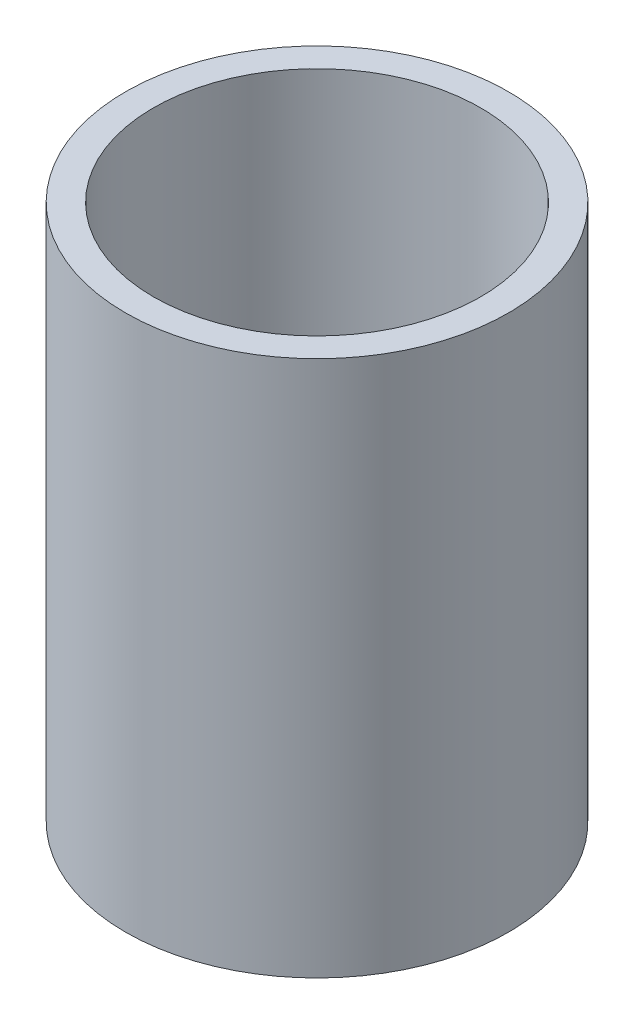
ISO-10303-21;
HEADER;
FILE_DESCRIPTION(('STEP AP214'),'2;1');
FILE_NAME('part.step','',(''),(''),'','','');
FILE_SCHEMA(('AUTOMOTIVE_DESIGN { 1 0 10303 214 1 1 1 1 }'));
ENDSEC;
DATA;
#1=APPLICATION_CONTEXT('core data for automotive mechanical design processes');
#2=APPLICATION_PROTOCOL_DEFINITION('international standard','automotive_design',2000,#1);
#3=PRODUCT_CONTEXT('',#1,'mechanical');
#4=PRODUCT('Part','Part','',(#3));
#5=PRODUCT_RELATED_PRODUCT_CATEGORY('part','',(#4));
#6=PRODUCT_DEFINITION_FORMATION('','',#4);
#7=PRODUCT_DEFINITION_CONTEXT('part definition',#1,'design');
#8=PRODUCT_DEFINITION('design','',#6,#7);
#9=PRODUCT_DEFINITION_SHAPE('','',#8);
#10=(LENGTH_UNIT() NAMED_UNIT(*) SI_UNIT(.MILLI.,.METRE.));
#11=(NAMED_UNIT(*) PLANE_ANGLE_UNIT() SI_UNIT($,.RADIAN.));
#12=(NAMED_UNIT(*) SI_UNIT($,.STERADIAN.) SOLID_ANGLE_UNIT());
#13=UNCERTAINTY_MEASURE_WITH_UNIT(LENGTH_MEASURE(1.E-05),#10,'distance_accuracy_value','');
#14=(GEOMETRIC_REPRESENTATION_CONTEXT(3) GLOBAL_UNCERTAINTY_ASSIGNED_CONTEXT((#13)) GLOBAL_UNIT_ASSIGNED_CONTEXT((#10,
#11,#12)) REPRESENTATION_CONTEXT('',''));
#15=CARTESIAN_POINT('',(0.,0.,0.));
#16=DIRECTION('',(0.,0.,1.));
#17=DIRECTION('',(1.,0.,0.));
#18=AXIS2_PLACEMENT_3D('',#15,#16,#17);
#19=CARTESIAN_POINT('',(0.,77.,0.));
#20=DIRECTION('',(0.,1.,0.));
#21=DIRECTION('',(0.,0.,1.));
#22=AXIS2_PLACEMENT_3D('',#19,#20,#21);
#23=PLANE('',#22);
#24=CARTESIAN_POINT('',(0.,77.,0.));
#25=DIRECTION('',(0.,1.,0.));
#26=DIRECTION('',(0.,0.,1.));
#27=AXIS2_PLACEMENT_3D('',#24,#25,#26);
#28=CIRCLE('',#27,27.5);
#29=CARTESIAN_POINT('',(0.,77.,27.5));
#30=VERTEX_POINT('',#29);
#31=EDGE_CURVE('E10',#30,#30,#28,.T.);
#32=ORIENTED_EDGE('',*,*,#31,.T.);
#33=EDGE_LOOP('',(#32));
#34=FACE_BOUND('',#33,.T.);
#35=CARTESIAN_POINT('',(0.,77.,0.));
#36=DIRECTION('',(0.,1.,0.));
#37=DIRECTION('',(0.,0.,1.));
#38=AXIS2_PLACEMENT_3D('',#35,#36,#37);
#39=CIRCLE('',#38,23.5);
#40=CARTESIAN_POINT('',(0.,77.,23.5));
#41=VERTEX_POINT('',#40);
#42=EDGE_CURVE('E42',#41,#41,#39,.T.);
#43=ORIENTED_EDGE('',*,*,#42,.F.);
#44=EDGE_LOOP('',(#43));
#45=FACE_BOUND('',#44,.T.);
#46=ADVANCED_FACE('F31',(#34,#45),#23,.T.);
#47=CARTESIAN_POINT('',(0.,0.,0.));
#48=DIRECTION('',(0.,1.,0.));
#49=DIRECTION('',(0.,0.,1.));
#50=AXIS2_PLACEMENT_3D('',#47,#48,#49);
#51=PLANE('',#50);
#52=CARTESIAN_POINT('',(0.,0.,0.));
#53=DIRECTION('',(0.,1.,0.));
#54=DIRECTION('',(0.,0.,1.));
#55=AXIS2_PLACEMENT_3D('',#52,#53,#54);
#56=CIRCLE('',#55,27.5);
#57=CARTESIAN_POINT('',(0.,0.,27.5));
#58=VERTEX_POINT('',#57);
#59=EDGE_CURVE('E35',#58,#58,#56,.T.);
#60=ORIENTED_EDGE('',*,*,#59,.F.);
#61=EDGE_LOOP('',(#60));
#62=FACE_BOUND('',#61,.T.);
#63=CARTESIAN_POINT('',(0.,0.,0.));
#64=DIRECTION('',(0.,1.,0.));
#65=DIRECTION('',(0.,0.,1.));
#66=AXIS2_PLACEMENT_3D('',#63,#64,#65);
#67=CIRCLE('',#66,23.5);
#68=CARTESIAN_POINT('',(0.,0.,23.5));
#69=VERTEX_POINT('',#68);
#70=EDGE_CURVE('E44',#69,#69,#67,.T.);
#71=ORIENTED_EDGE('',*,*,#70,.T.);
#72=EDGE_LOOP('',(#71));
#73=FACE_BOUND('',#72,.T.);
#74=ADVANCED_FACE('F54',(#62,#73),#51,.F.);
#75=CARTESIAN_POINT('',(0.,77.,0.));
#76=DIRECTION('',(0.,-1.,0.));
#77=DIRECTION('',(0.,0.,-1.));
#78=AXIS2_PLACEMENT_3D('',#75,#76,#77);
#79=CYLINDRICAL_SURFACE('',#78,27.5);
#80=ORIENTED_EDGE('',*,*,#31,.F.);
#81=EDGE_LOOP('',(#80));
#82=FACE_BOUND('',#81,.T.);
#83=ORIENTED_EDGE('',*,*,#59,.T.);
#84=EDGE_LOOP('',(#83));
#85=FACE_BOUND('',#84,.T.);
#86=ADVANCED_FACE('F33',(#82,#85),#79,.T.);
#87=CARTESIAN_POINT('',(0.,77.,0.));
#88=DIRECTION('',(0.,-1.,0.));
#89=DIRECTION('',(0.,0.,-1.));
#90=AXIS2_PLACEMENT_3D('',#87,#88,#89);
#91=CYLINDRICAL_SURFACE('',#90,23.5);
#92=ORIENTED_EDGE('',*,*,#42,.T.);
#93=EDGE_LOOP('',(#92));
#94=FACE_BOUND('',#93,.T.);
#95=ORIENTED_EDGE('',*,*,#70,.F.);
#96=EDGE_LOOP('',(#95));
#97=FACE_BOUND('',#96,.T.);
#98=ADVANCED_FACE('F50',(#94,#97),#91,.F.);
#99=CLOSED_SHELL('',(#46,#74,#86,#98));
#100=MANIFOLD_SOLID_BREP('B2',#99);
#101=ADVANCED_BREP_SHAPE_REPRESENTATION('',(#18,#100),#14);
#102=SHAPE_DEFINITION_REPRESENTATION(#9,#101);
ENDSEC;
END-ISO-10303-21;
